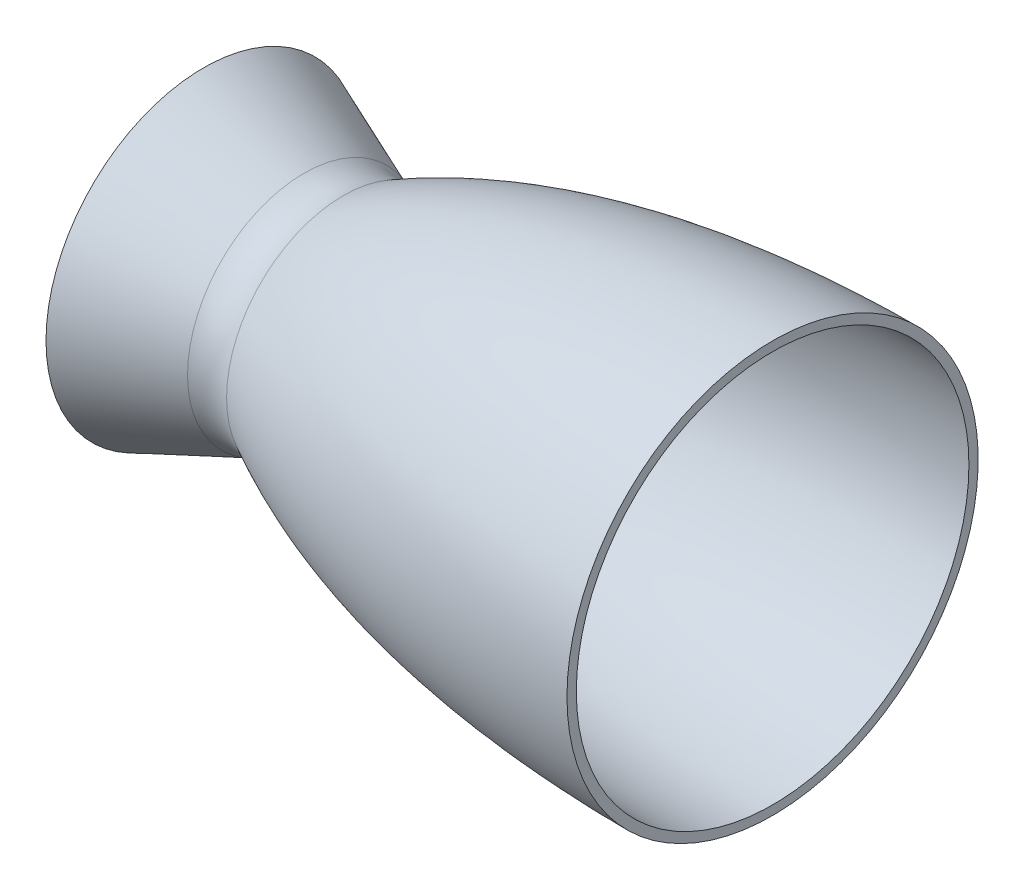
ISO-10303-21;
HEADER;
FILE_DESCRIPTION(('STEP AP214'),'2;1');
FILE_NAME('part.step','',(''),(''),'','','');
FILE_SCHEMA(('AUTOMOTIVE_DESIGN { 1 0 10303 214 1 1 1 1 }'));
ENDSEC;
DATA;
#1=APPLICATION_CONTEXT('core data for automotive mechanical design processes');
#2=APPLICATION_PROTOCOL_DEFINITION('international standard','automotive_design',2000,#1);
#3=PRODUCT_CONTEXT('',#1,'mechanical');
#4=PRODUCT('Part','Part','',(#3));
#5=PRODUCT_RELATED_PRODUCT_CATEGORY('part','',(#4));
#6=PRODUCT_DEFINITION_FORMATION('','',#4);
#7=PRODUCT_DEFINITION_CONTEXT('part definition',#1,'design');
#8=PRODUCT_DEFINITION('design','',#6,#7);
#9=PRODUCT_DEFINITION_SHAPE('','',#8);
#10=(LENGTH_UNIT() NAMED_UNIT(*) SI_UNIT(.MILLI.,.METRE.));
#11=(NAMED_UNIT(*) PLANE_ANGLE_UNIT() SI_UNIT($,.RADIAN.));
#12=(NAMED_UNIT(*) SI_UNIT($,.STERADIAN.) SOLID_ANGLE_UNIT());
#13=UNCERTAINTY_MEASURE_WITH_UNIT(LENGTH_MEASURE(1.E-05),#10,'distance_accuracy_value','');
#14=(GEOMETRIC_REPRESENTATION_CONTEXT(3) GLOBAL_UNCERTAINTY_ASSIGNED_CONTEXT((#13)) GLOBAL_UNIT_ASSIGNED_CONTEXT((#10,
#11,#12)) REPRESENTATION_CONTEXT('',''));
#15=CARTESIAN_POINT('',(0.,0.,0.));
#16=DIRECTION('',(0.,0.,1.));
#17=DIRECTION('',(1.,0.,0.));
#18=AXIS2_PLACEMENT_3D('',#15,#16,#17);
#19=CARTESIAN_POINT('',(-7.82906536293796,0.,0.));
#20=DIRECTION('',(-1.,0.,0.));
#21=DIRECTION('',(0.,0.,1.));
#22=AXIS2_PLACEMENT_3D('',#19,#20,#21);
#23=TOROIDAL_SURFACE('',#22,51.2058324405721,15.);
#24=CARTESIAN_POINT('',(-14.0754238601244,0.,0.));
#25=DIRECTION('',(-1.,0.,0.));
#26=DIRECTION('',(0.,0.,1.));
#27=AXIS2_PLACEMENT_3D('',#24,#25,#26);
#28=CIRCLE('',#27,37.5682738055148);
#29=CARTESIAN_POINT('',(-14.0754238601244,0.,37.5682738055148));
#30=VERTEX_POINT('',#29);
#31=EDGE_CURVE('E10',#30,#30,#28,.T.);
#32=ORIENTED_EDGE('',*,*,#31,.F.);
#33=EDGE_LOOP('',(#32));
#34=FACE_BOUND('',#33,.T.);
#35=CARTESIAN_POINT('',(-1.39717120049471,0.,0.));
#36=DIRECTION('',(-1.,0.,0.));
#37=DIRECTION('',(0.,0.,1.));
#38=AXIS2_PLACEMENT_3D('',#35,#36,#37);
#39=CIRCLE('',#38,37.6547905070849);
#40=CARTESIAN_POINT('',(-1.39717120049471,0.,37.6547905070849));
#41=VERTEX_POINT('',#40);
#42=EDGE_CURVE('E61',#41,#41,#39,.T.);
#43=ORIENTED_EDGE('',*,*,#42,.T.);
#44=EDGE_LOOP('',(#43));
#45=FACE_BOUND('',#44,.T.);
#46=ADVANCED_FACE('F33',(#34,#45),#23,.F.);
#47=CARTESIAN_POINT('',(-14.0754238601244,0.,0.));
#48=DIRECTION('',(-1.,0.,0.));
#49=DIRECTION('',(0.,0.,1.));
#50=AXIS2_PLACEMENT_3D('',#47,#48,#49);
#51=CONICAL_SURFACE('',#50,37.5682738055148,0.388212348122702);
#52=CARTESIAN_POINT('',(-46.4709767758697,0.,0.));
#53=DIRECTION('',(-1.,0.,0.));
#54=DIRECTION('',(0.,0.,1.));
#55=AXIS2_PLACEMENT_3D('',#52,#53,#54);
#56=CIRCLE('',#55,50.8169775641149);
#57=CARTESIAN_POINT('',(-46.4709767758697,0.,50.8169775641149));
#58=VERTEX_POINT('',#57);
#59=EDGE_CURVE('E39',#58,#58,#56,.T.);
#60=ORIENTED_EDGE('',*,*,#59,.F.);
#61=EDGE_LOOP('',(#60));
#62=FACE_BOUND('',#61,.T.);
#63=ORIENTED_EDGE('',*,*,#31,.T.);
#64=EDGE_LOOP('',(#63));
#65=FACE_BOUND('',#64,.T.);
#66=ADVANCED_FACE('F97',(#62,#65),#51,.T.);
#67=CARTESIAN_POINT('',(-46.4709767758697,0.,0.));
#68=DIRECTION('',(1.,0.,0.));
#69=DIRECTION('',(0.,0.,-1.));
#70=AXIS2_PLACEMENT_3D('',#67,#68,#69);
#71=CONICAL_SURFACE('',#70,50.8169775641149,1.18258397867219);
#72=CARTESIAN_POINT('',(-47.6065799551783,0.,0.));
#73=DIRECTION('',(-1.,0.,0.));
#74=DIRECTION('',(0.,0.,1.));
#75=AXIS2_PLACEMENT_3D('',#72,#73,#74);
#76=CIRCLE('',#75,48.0402158856225);
#77=CARTESIAN_POINT('',(-47.6065799551783,0.,48.0402158856225));
#78=VERTEX_POINT('',#77);
#79=EDGE_CURVE('E43',#78,#78,#76,.T.);
#80=ORIENTED_EDGE('',*,*,#79,.F.);
#81=EDGE_LOOP('',(#80));
#82=FACE_BOUND('',#81,.T.);
#83=ORIENTED_EDGE('',*,*,#59,.T.);
#84=EDGE_LOOP('',(#83));
#85=FACE_BOUND('',#84,.T.);
#86=ADVANCED_FACE('F94',(#82,#85),#71,.T.);
#87=CARTESIAN_POINT('',(-47.6065799551783,0.,0.));
#88=DIRECTION('',(-1.,0.,0.));
#89=DIRECTION('',(0.,0.,1.));
#90=AXIS2_PLACEMENT_3D('',#87,#88,#89);
#91=CONICAL_SURFACE('',#90,48.0402158856225,0.388212348122702);
#92=CARTESIAN_POINT('',(-15.211027039433,0.,0.));
#93=DIRECTION('',(-1.,0.,0.));
#94=DIRECTION('',(0.,0.,1.));
#95=AXIS2_PLACEMENT_3D('',#92,#93,#94);
#96=CIRCLE('',#95,34.7915121270223);
#97=CARTESIAN_POINT('',(-15.211027039433,0.,34.7915121270223));
#98=VERTEX_POINT('',#97);
#99=EDGE_CURVE('E47',#98,#98,#96,.T.);
#100=ORIENTED_EDGE('',*,*,#99,.F.);
#101=EDGE_LOOP('',(#100));
#102=FACE_BOUND('',#101,.T.);
#103=ORIENTED_EDGE('',*,*,#79,.T.);
#104=EDGE_LOOP('',(#103));
#105=FACE_BOUND('',#104,.T.);
#106=ADVANCED_FACE('F90',(#102,#105),#91,.F.);
#107=CARTESIAN_POINT('',(-7.82906536293796,0.,0.));
#108=DIRECTION('',(-1.,0.,0.));
#109=DIRECTION('',(0.,0.,1.));
#110=AXIS2_PLACEMENT_3D('',#107,#108,#109);
#111=TOROIDAL_SURFACE('',#110,51.2058324405721,17.997868472379);
#112=CARTESIAN_POINT('',(0.,0.,0.));
#113=DIRECTION('',(-1.,0.,0.));
#114=DIRECTION('',(0.,0.,1.));
#115=AXIS2_PLACEMENT_3D('',#112,#113,#114);
#116=CIRCLE('',#115,35.);
#117=CARTESIAN_POINT('',(0.,0.,35.));
#118=VERTEX_POINT('',#117);
#119=EDGE_CURVE('E52',#118,#118,#116,.T.);
#120=ORIENTED_EDGE('',*,*,#119,.F.);
#121=EDGE_LOOP('',(#120));
#122=FACE_BOUND('',#121,.T.);
#123=ORIENTED_EDGE('',*,*,#99,.T.);
#124=EDGE_LOOP('',(#123));
#125=FACE_BOUND('',#124,.T.);
#126=ADVANCED_FACE('F86',(#122,#125),#111,.T.);
#127=CARTESIAN_POINT('',(0.,35.,0.));
#128=CARTESIAN_POINT('',(0.554982884689931,35.292078075911,0.));
#129=CARTESIAN_POINT('',(1.52954852541324,35.8049754373324,0.));
#130=CARTESIAN_POINT('',(2.93716851538302,36.5286469740346,0.));
#131=CARTESIAN_POINT('',(4.67050500756863,37.4032473312133,0.));
#132=CARTESIAN_POINT('',(6.44177795214239,38.2709789008739,0.));
#133=CARTESIAN_POINT('',(8.72353094020484,39.355824676439,0.));
#134=CARTESIAN_POINT('',(10.6052774504737,40.2228831249829,0.));
#135=CARTESIAN_POINT('',(13.0322906712893,41.3061333566658,0.));
#136=CARTESIAN_POINT('',(15.0362094527817,42.1711470902938,0.));
#137=CARTESIAN_POINT('',(17.0870940860694,43.0268022601925,0.));
#138=CARTESIAN_POINT('',(18.6734036818477,43.6732314360975,0.));
#139=CARTESIAN_POINT('',(20.8569847770024,44.541896715604,0.));
#140=CARTESIAN_POINT('',(23.0942579884496,45.3990461697632,0.));
#141=CARTESIAN_POINT('',(25.9891264843998,46.466381409672,0.));
#142=CARTESIAN_POINT('',(28.386871240884,47.3152071379455,0.));
#143=CARTESIAN_POINT('',(30.8454135496211,48.1500884085248,0.));
#144=CARTESIAN_POINT('',(32.753517217081,48.7795262006771,0.));
#145=CARTESIAN_POINT('',(34.7085279134445,49.4054819575128,0.));
#146=CARTESIAN_POINT('',(36.712155184624,50.0275356362633,0.));
#147=CARTESIAN_POINT('',(39.4823153875266,50.8607242560605,0.));
#148=CARTESIAN_POINT('',(42.3272869525272,51.674557280251,0.));
#149=CARTESIAN_POINT('',(45.2492088516472,52.4683276673689,0.));
#150=CARTESIAN_POINT('',(47.5239458502858,53.0641859485215,0.));
#151=CARTESIAN_POINT('',(50.6761896674929,53.8593461273068,0.));
#152=CARTESIAN_POINT('',(53.9175050143009,54.6292382294764,0.));
#153=CARTESIAN_POINT('',(57.250572852087,55.3729829497331,0.));
#154=CARTESIAN_POINT('',(59.8514175736142,55.9280800583215,0.));
#155=CARTESIAN_POINT('',(62.5252430469086,56.4728227945429,0.));
#156=CARTESIAN_POINT('',(65.2749403215198,57.0063222604038,0.));
#157=CARTESIAN_POINT('',(69.0985439533947,57.7110938348362,0.));
#158=CARTESIAN_POINT('',(74.0922248075621,58.5579121997333,0.));
#159=CARTESIAN_POINT('',(79.2419689730675,59.3311983519231,0.));
#160=CARTESIAN_POINT('',(83.5467269706308,59.9158033541892,0.));
#161=CARTESIAN_POINT('',(88.1143611757255,60.4917493393278,0.));
#162=CARTESIAN_POINT('',(92.8278714426428,61.016524651567,0.));
#163=CARTESIAN_POINT('',(97.6925762437647,61.4883221726121,0.));
#164=CARTESIAN_POINT('',(101.514881986679,61.8219193173706,0.));
#165=CARTESIAN_POINT('',(105.461815143949,62.1281277774105,0.));
#166=CARTESIAN_POINT('',(109.539052293928,62.4048353893555,0.));
#167=CARTESIAN_POINT('',(113.752598134298,62.6499575666368,0.));
#168=CARTESIAN_POINT('',(118.108825401747,62.8610142799226,0.));
#169=CARTESIAN_POINT('',(122.614486305004,63.0358322807469,0.));
#170=CARTESIAN_POINT('',(127.276766251751,63.1706264853498,0.));
#171=CARTESIAN_POINT('',(132.103271492616,63.2666012228311,0.));
#172=CARTESIAN_POINT('',(135.376710134935,63.2915551583019,0.));
#173=CARTESIAN_POINT('',(137.04201,63.30425,0.));
#174=B_SPLINE_CURVE_WITH_KNOTS('',3,(#127,#128,#129,#130,#131,#132,#133,#134,#135,#136,#137,
#138,#139,#140,#141,#142,#143,#144,#145,#146,#147,#148,#149,#150,#151,#152,#153,#154,#155,#156,
#157,#158,#159,#160,#161,#162,#163,#164,#165,#166,#167,#168,#169,#170,#171,#172,#173),
.UNSPECIFIED.,.F.,.F.,(4,1,1,1,1,1,1,1,1,1,1,1,1,1,1,1,1,1,1,1,1,1,1,1,1,1,1,1,1,1,1,1,1,1,1,1,
1,1,1,1,1,1,1,1,4),(0.,0.0133163393690714,0.0233838685251685,0.0336064850873972,
0.0545401287206068,0.0652629671460166,0.0872521169149069,0.0985317502113014,0.121695809509658,
0.133595110539524,0.145716248467118,0.158067223378815,0.183493170440226,0.196585982866281,
0.223578759253645,0.237499019578391,0.251715999244423,0.266240967059522,0.281085577190483,
0.296262138445042,0.327662632939131,0.34391387895724,0.36055177530363,0.377591615742772,
0.412941995344426,0.431287050452674,0.450103019352553,0.469409391295083,0.489226517772971,
0.509575972018097,0.551963386739553,0.596767231487816,0.620142345856793,0.644205068508054,
0.694519485789619,0.720838909211759,0.74798166521469,0.775986766081096,0.804895700963681,
0.834752506483194,0.865603944427531,0.897499705591209,0.930492751626352,0.964639504818791,1.),.UNSPECIFIED.);
#175=CARTESIAN_POINT('',(-87.9327814812999,0.,0.));
#176=DIRECTION('',(-1.,0.,0.));
#177=AXIS1_PLACEMENT('',#175,#176);
#178=SURFACE_OF_REVOLUTION('',#174,#177);
#179=CARTESIAN_POINT('',(137.04201,0.,0.));
#180=DIRECTION('',(-1.,0.,0.));
#181=DIRECTION('',(0.,0.,1.));
#182=AXIS2_PLACEMENT_3D('',#179,#180,#181);
#183=CIRCLE('',#182,63.30425);
#184=CARTESIAN_POINT('',(137.04201,0.,63.30425));
#185=VERTEX_POINT('',#184);
#186=EDGE_CURVE('E55',#185,#185,#183,.T.);
#187=ORIENTED_EDGE('',*,*,#186,.F.);
#188=EDGE_LOOP('',(#187));
#189=FACE_BOUND('',#188,.T.);
#190=ORIENTED_EDGE('',*,*,#119,.T.);
#191=EDGE_LOOP('',(#190));
#192=FACE_BOUND('',#191,.T.);
#193=ADVANCED_FACE('F82',(#189,#192),#178,.T.);
#194=CARTESIAN_POINT('',(137.04201,0.,0.));
#195=DIRECTION('',(-1.,0.,0.));
#196=DIRECTION('',(0.,0.,1.));
#197=AXIS2_PLACEMENT_3D('',#194,#195,#196);
#198=CONICAL_SURFACE('',#197,63.30425,1.56317331783224);
#199=CARTESIAN_POINT('',(137.019141194599,0.,0.));
#200=DIRECTION('',(-1.,0.,0.));
#201=DIRECTION('',(0.,0.,1.));
#202=AXIS2_PLACEMENT_3D('',#199,#200,#201);
#203=CIRCLE('',#202,66.3041628350236);
#204=CARTESIAN_POINT('',(137.019141194599,0.,66.3041628350236));
#205=VERTEX_POINT('',#204);
#206=EDGE_CURVE('E58',#205,#205,#203,.T.);
#207=ORIENTED_EDGE('',*,*,#206,.F.);
#208=EDGE_LOOP('',(#207));
#209=FACE_BOUND('',#208,.T.);
#210=ORIENTED_EDGE('',*,*,#186,.T.);
#211=EDGE_LOOP('',(#210));
#212=FACE_BOUND('',#211,.T.);
#213=ADVANCED_FACE('F78',(#209,#212),#198,.T.);
#214=CARTESIAN_POINT('',(137.019141194599,66.3041628350236,0.));
#215=CARTESIAN_POINT('',(135.547424791404,66.2929437103753,0.));
#216=CARTESIAN_POINT('',(134.070837434688,66.2816993177175,0.));
#217=CARTESIAN_POINT('',(131.10810080553,66.2446808650385,0.));
#218=CARTESIAN_POINT('',(129.625148542587,66.2180342560789,0.));
#219=CARTESIAN_POINT('',(125.184186023842,66.1179758904583,0.));
#220=CARTESIAN_POINT('',(122.224200635943,66.0261444127127,0.));
#221=CARTESIAN_POINT('',(113.343652658359,65.6636605876321,0.));
#222=CARTESIAN_POINT('',(107.425404783098,65.3091824186422,0.));
#223=CARTESIAN_POINT('',(95.6037250320399,64.3422416545935,0.));
#224=CARTESIAN_POINT('',(89.7002246365313,63.7299139187602,0.));
#225=CARTESIAN_POINT('',(77.9237634308207,62.2103607245037,0.));
#226=CARTESIAN_POINT('',(72.0507744637797,61.3031305574143,0.));
#227=CARTESIAN_POINT('',(60.3580004989192,59.1509146087782,0.));
#228=CARTESIAN_POINT('',(54.5380920999309,57.9058899850752,0.));
#229=CARTESIAN_POINT('',(42.983668180752,55.0298527069796,0.));
#230=CARTESIAN_POINT('',(37.2490468484608,53.3987488093419,0.));
#231=CARTESIAN_POINT('',(25.9102900732102,49.699677139218,0.));
#232=CARTESIAN_POINT('',(20.3059499055719,47.6313512559329,0.));
#233=CARTESIAN_POINT('',(12.042210126922,44.1656426875089,0.));
#234=CARTESIAN_POINT('',(9.31154575045941,42.9499334917539,0.));
#235=CARTESIAN_POINT('',(5.25796852531914,41.0321692809352,0.));
#236=CARTESIAN_POINT('',(3.91381249873239,40.3772291229303,0.));
#237=CARTESIAN_POINT('',(1.90923494315154,39.3710043315416,0.));
#238=CARTESIAN_POINT('',(1.24329952286657,39.0319131033902,0.));
#239=CARTESIAN_POINT('',(-0.0863640613584878,38.3445289200526,0.));
#240=CARTESIAN_POINT('',(-0.745970646578141,37.9975063098009,0.));
#241=CARTESIAN_POINT('',(-1.3971712004947,37.6547905070849,0.));
#242=B_SPLINE_CURVE_WITH_KNOTS('',3,(#214,#215,#216,#217,#218,#219,#220,#221,#222,#223,#224,
#225,#226,#227,#228,#229,#230,#231,#232,#233,#234,#235,#236,#237,#238,#239,#240,#241),
.UNSPECIFIED.,.F.,.F.,(4,2,2,2,2,2,2,2,2,2,2,2,2,4),(0.,0.0312500000000004,0.0625000000000009,
0.125000000000001,0.250000000000001,0.375000000000001,0.500000000000001,0.625,0.75,0.875,0.9375,
0.96875,0.984375,1.),.UNSPECIFIED.);
#243=CARTESIAN_POINT('',(-87.9327814812999,0.,0.));
#244=DIRECTION('',(-1.,0.,0.));
#245=AXIS1_PLACEMENT('',#243,#244);
#246=SURFACE_OF_REVOLUTION('',#242,#245);
#247=ORIENTED_EDGE('',*,*,#42,.F.);
#248=EDGE_LOOP('',(#247));
#249=FACE_BOUND('',#248,.T.);
#250=ORIENTED_EDGE('',*,*,#206,.T.);
#251=EDGE_LOOP('',(#250));
#252=FACE_BOUND('',#251,.T.);
#253=ADVANCED_FACE('F75',(#249,#252),#246,.T.);
#254=CLOSED_SHELL('',(#46,#66,#86,#106,#126,#193,#213,#253));
#255=MANIFOLD_SOLID_BREP('B2',#254);
#256=ADVANCED_BREP_SHAPE_REPRESENTATION('',(#18,#255),#14);
#257=SHAPE_DEFINITION_REPRESENTATION(#9,#256);
ENDSEC;
END-ISO-10303-21;
